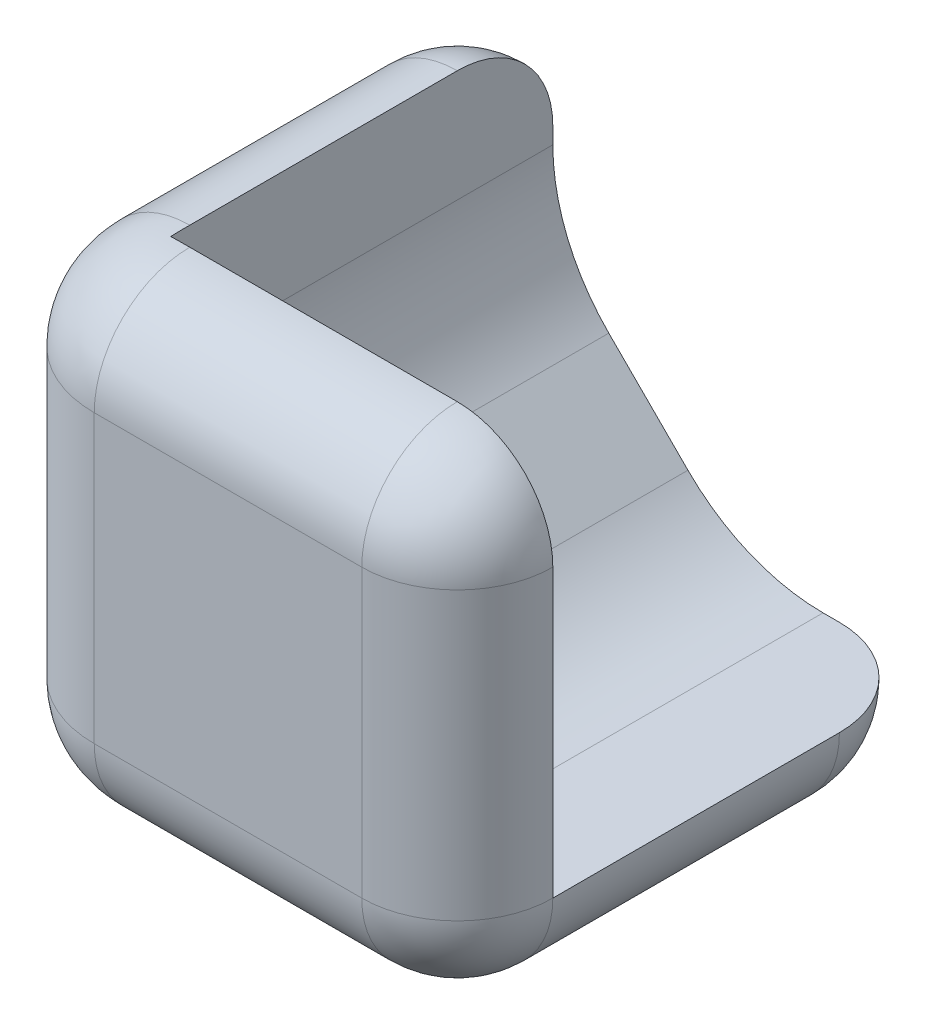
ISO-10303-21;
HEADER;
FILE_DESCRIPTION(('STEP AP214'),'2;1');
FILE_NAME('part.step','',(''),(''),'','','');
FILE_SCHEMA(('AUTOMOTIVE_DESIGN { 1 0 10303 214 1 1 1 1 }'));
ENDSEC;
DATA;
#1=APPLICATION_CONTEXT('core data for automotive mechanical design processes');
#2=APPLICATION_PROTOCOL_DEFINITION('international standard','automotive_design',2000,#1);
#3=PRODUCT_CONTEXT('',#1,'mechanical');
#4=PRODUCT('Part','Part','',(#3));
#5=PRODUCT_RELATED_PRODUCT_CATEGORY('part','',(#4));
#6=PRODUCT_DEFINITION_FORMATION('','',#4);
#7=PRODUCT_DEFINITION_CONTEXT('part definition',#1,'design');
#8=PRODUCT_DEFINITION('design','',#6,#7);
#9=PRODUCT_DEFINITION_SHAPE('','',#8);
#10=(LENGTH_UNIT() NAMED_UNIT(*) SI_UNIT(.MILLI.,.METRE.));
#11=(NAMED_UNIT(*) PLANE_ANGLE_UNIT() SI_UNIT($,.RADIAN.));
#12=(NAMED_UNIT(*) SI_UNIT($,.STERADIAN.) SOLID_ANGLE_UNIT());
#13=UNCERTAINTY_MEASURE_WITH_UNIT(LENGTH_MEASURE(1.E-05),#10,'distance_accuracy_value','');
#14=(GEOMETRIC_REPRESENTATION_CONTEXT(3) GLOBAL_UNCERTAINTY_ASSIGNED_CONTEXT((#13)) GLOBAL_UNIT_ASSIGNED_CONTEXT((#10,
#11,#12)) REPRESENTATION_CONTEXT('',''));
#15=CARTESIAN_POINT('',(0.,0.,0.));
#16=DIRECTION('',(0.,0.,1.));
#17=DIRECTION('',(1.,0.,0.));
#18=AXIS2_PLACEMENT_3D('',#15,#16,#17);
#19=CARTESIAN_POINT('',(0.,20.,-10.));
#20=DIRECTION('',(0.,0.,-1.));
#21=DIRECTION('',(-1.,0.,0.));
#22=AXIS2_PLACEMENT_3D('',#19,#20,#21);
#23=PLANE('',#22);
#24=CARTESIAN_POINT('',(7.07106781186547,15.,-10.));
#25=DIRECTION('',(0.,0.,-1.));
#26=DIRECTION('',(-1.,0.,0.));
#27=AXIS2_PLACEMENT_3D('',#24,#25,#26);
#28=CIRCLE('',#27,5.);
#29=CARTESIAN_POINT('',(7.0710678118655,10.,-10.));
#30=VERTEX_POINT('',#29);
#31=CARTESIAN_POINT('',(3.53553390593272,11.4644660940673,-10.));
#32=VERTEX_POINT('',#31);
#33=EDGE_CURVE('E171',#30,#32,#28,.T.);
#34=ORIENTED_EDGE('',*,*,#33,.F.);
#35=DIRECTION('',(1.,0.,0.));
#36=VECTOR('',#35,1.);
#37=CARTESIAN_POINT('',(0.,10.,-10.));
#38=LINE('',#37,#36);
#39=CARTESIAN_POINT('',(0.,10.,-10.));
#40=VERTEX_POINT('',#39);
#41=EDGE_CURVE('E381',#30,#40,#38,.F.);
#42=ORIENTED_EDGE('',*,*,#41,.T.);
#43=DIRECTION('',(0.,1.,0.));
#44=VECTOR('',#43,1.);
#45=CARTESIAN_POINT('',(0.,20.,-10.));
#46=LINE('',#45,#44);
#47=CARTESIAN_POINT('',(0.,17.0710678118655,-10.));
#48=VERTEX_POINT('',#47);
#49=EDGE_CURVE('E169',#40,#48,#46,.T.);
#50=ORIENTED_EDGE('',*,*,#49,.T.);
#51=CARTESIAN_POINT('',(5.,17.0710678118655,-10.));
#52=DIRECTION('',(0.,0.,-1.));
#53=DIRECTION('',(-1.,0.,0.));
#54=AXIS2_PLACEMENT_3D('',#51,#52,#53);
#55=CIRCLE('',#54,5.);
#56=CARTESIAN_POINT('',(1.46446609406728,13.5355339059327,-10.));
#57=VERTEX_POINT('',#56);
#58=EDGE_CURVE('E155',#57,#48,#55,.T.);
#59=ORIENTED_EDGE('',*,*,#58,.F.);
#60=DIRECTION('',(-0.707106781186548,0.707106781186547,0.));
#61=VECTOR('',#60,1.);
#62=CARTESIAN_POINT('',(7.5,7.5,-10.));
#63=LINE('',#62,#61);
#64=EDGE_CURVE('E167',#32,#57,#63,.T.);
#65=ORIENTED_EDGE('',*,*,#64,.F.);
#66=EDGE_LOOP('',(#34,#42,#50,#59,#65));
#67=FACE_BOUND('',#66,.T.);
#68=ADVANCED_FACE('F39',(#67),#23,.T.);
#69=CARTESIAN_POINT('',(0.,10.,0.));
#70=DIRECTION('',(0.,-1.,0.));
#71=DIRECTION('',(0.,0.,-1.));
#72=AXIS2_PLACEMENT_3D('',#69,#70,#71);
#73=PLANE('',#72);
#74=DIRECTION('',(0.,0.,-1.));
#75=VECTOR('',#74,1.);
#76=CARTESIAN_POINT('',(10.,10.,0.));
#77=LINE('',#76,#75);
#78=CARTESIAN_POINT('',(10.,10.,0.));
#79=VERTEX_POINT('',#78);
#80=CARTESIAN_POINT('',(10.,10.,-7.5));
#81=VERTEX_POINT('',#80);
#82=EDGE_CURVE('E202',#79,#81,#77,.T.);
#83=ORIENTED_EDGE('',*,*,#82,.T.);
#84=CARTESIAN_POINT('',(7.5,10.,-7.5));
#85=DIRECTION('',(0.,-1.,0.));
#86=DIRECTION('',(0.,0.,-1.));
#87=AXIS2_PLACEMENT_3D('',#84,#85,#86);
#88=CIRCLE('',#87,2.5);
#89=CARTESIAN_POINT('',(7.5,10.,-10.));
#90=VERTEX_POINT('',#89);
#91=EDGE_CURVE('E11',#81,#90,#88,.F.);
#92=ORIENTED_EDGE('',*,*,#91,.T.);
#93=DIRECTION('',(-1.,0.,0.));
#94=VECTOR('',#93,1.);
#95=CARTESIAN_POINT('',(0.,10.,-10.));
#96=LINE('',#95,#94);
#97=EDGE_CURVE('E206',#90,#30,#96,.T.);
#98=ORIENTED_EDGE('',*,*,#97,.T.);
#99=DIRECTION('',(0.,0.,1.));
#100=VECTOR('',#99,1.);
#101=CARTESIAN_POINT('',(7.0710678118655,10.,-10.));
#102=LINE('',#101,#100);
#103=CARTESIAN_POINT('',(7.0710678118655,10.,0.));
#104=VERTEX_POINT('',#103);
#105=EDGE_CURVE('E187',#30,#104,#102,.T.);
#106=ORIENTED_EDGE('',*,*,#105,.T.);
#107=DIRECTION('',(1.,0.,0.));
#108=VECTOR('',#107,1.);
#109=CARTESIAN_POINT('',(20.,10.,0.));
#110=LINE('',#109,#108);
#111=EDGE_CURVE('E190',#104,#79,#110,.T.);
#112=ORIENTED_EDGE('',*,*,#111,.T.);
#113=EDGE_LOOP('',(#83,#92,#98,#106,#112));
#114=FACE_BOUND('',#113,.T.);
#115=ADVANCED_FACE('F237',(#114),#73,.F.);
#116=CARTESIAN_POINT('',(0.,10.,-20.));
#117=DIRECTION('',(-1.,0.,0.));
#118=DIRECTION('',(0.,0.,1.));
#119=AXIS2_PLACEMENT_3D('',#116,#117,#118);
#120=PLANE('',#119);
#121=DIRECTION('',(0.,1.,0.));
#122=VECTOR('',#121,1.);
#123=CARTESIAN_POINT('',(0.,20.,-10.));
#124=LINE('',#123,#122);
#125=CARTESIAN_POINT('',(0.,17.5,-10.));
#126=VERTEX_POINT('',#125);
#127=EDGE_CURVE('E200',#48,#126,#124,.T.);
#128=ORIENTED_EDGE('',*,*,#127,.T.);
#129=CARTESIAN_POINT('',(0.,17.5,-7.5));
#130=DIRECTION('',(-1.,0.,0.));
#131=DIRECTION('',(0.,0.,1.));
#132=AXIS2_PLACEMENT_3D('',#129,#130,#131);
#133=CIRCLE('',#132,2.5);
#134=CARTESIAN_POINT('',(0.,20.,-7.5));
#135=VERTEX_POINT('',#134);
#136=EDGE_CURVE('E377',#126,#135,#133,.F.);
#137=ORIENTED_EDGE('',*,*,#136,.T.);
#138=DIRECTION('',(0.,0.,1.));
#139=VECTOR('',#138,1.);
#140=CARTESIAN_POINT('',(0.,20.,0.));
#141=LINE('',#140,#139);
#142=CARTESIAN_POINT('',(0.,20.,-0.5));
#143=VERTEX_POINT('',#142);
#144=EDGE_CURVE('E204',#135,#143,#141,.T.);
#145=ORIENTED_EDGE('',*,*,#144,.T.);
#146=CARTESIAN_POINT('',(0.,20.,-0.5));
#147=CARTESIAN_POINT('',(0.,19.9999555590469,-0.458322618836104));
#148=CARTESIAN_POINT('',(0.,20.0000042889637,-0.416644369246161));
#149=CARTESIAN_POINT('',(0.,19.9999009024132,-0.333297581464345));
#150=CARTESIAN_POINT('',(0.,19.9997488300437,-0.291629043149498));
#151=CARTESIAN_POINT('',(0.,19.9988568555154,-0.208284004328043));
#152=CARTESIAN_POINT('',(0.,19.9981168007554,-0.166607504562833));
#153=CARTESIAN_POINT('',(0.,19.9956258247218,-0.0832771616506614));
#154=CARTESIAN_POINT('',(0.,19.9938746786647,-0.0416233256040609));
#155=CARTESIAN_POINT('',(0.,19.9914065868875,0.));
#156=B_SPLINE_CURVE_WITH_KNOTS('',3,(#146,#147,#148,#149,#150,#151,#152,#153,#154,#155),
.UNSPECIFIED.,.F.,.F.,(4,2,2,2,4),(0.,0.125033609268124,0.250039764792167,0.375078374192874,
0.500144792594201),.UNSPECIFIED.);
#157=CARTESIAN_POINT('',(0.,19.9914065868875,0.));
#158=VERTEX_POINT('',#157);
#159=EDGE_CURVE('E215',#143,#158,#156,.T.);
#160=ORIENTED_EDGE('',*,*,#159,.T.);
#161=DIRECTION('',(0.,1.,0.));
#162=VECTOR('',#161,1.);
#163=CARTESIAN_POINT('',(0.,10.,0.));
#164=LINE('',#163,#162);
#165=CARTESIAN_POINT('',(0.,17.0710678118655,0.));
#166=VERTEX_POINT('',#165);
#167=EDGE_CURVE('E193',#166,#158,#164,.T.);
#168=ORIENTED_EDGE('',*,*,#167,.F.);
#169=DIRECTION('',(0.,0.,1.));
#170=VECTOR('',#169,1.);
#171=CARTESIAN_POINT('',(0.,17.0710678118655,-10.));
#172=LINE('',#171,#170);
#173=EDGE_CURVE('E161',#48,#166,#172,.T.);
#174=ORIENTED_EDGE('',*,*,#173,.F.);
#175=EDGE_LOOP('',(#128,#137,#145,#160,#168,#174));
#176=FACE_BOUND('',#175,.T.);
#177=ADVANCED_FACE('F232',(#176),#120,.F.);
#178=CARTESIAN_POINT('',(20.,10.,0.));
#179=DIRECTION('',(0.,0.,1.));
#180=DIRECTION('',(1.,0.,0.));
#181=AXIS2_PLACEMENT_3D('',#178,#179,#180);
#182=PLANE('',#181);
#183=DIRECTION('',(1.,0.,0.));
#184=VECTOR('',#183,1.);
#185=CARTESIAN_POINT('',(20.,20.,0.));
#186=LINE('',#185,#184);
#187=CARTESIAN_POINT('',(0.500000000000003,20.,0.));
#188=VERTEX_POINT('',#187);
#189=CARTESIAN_POINT('',(7.5,20.,0.));
#190=VERTEX_POINT('',#189);
#191=EDGE_CURVE('E189',#188,#190,#186,.T.);
#192=ORIENTED_EDGE('',*,*,#191,.T.);
#193=CARTESIAN_POINT('',(7.5,17.5,0.));
#194=DIRECTION('',(0.,0.,1.));
#195=DIRECTION('',(1.,0.,0.));
#196=AXIS2_PLACEMENT_3D('',#193,#194,#195);
#197=CIRCLE('',#196,2.5);
#198=CARTESIAN_POINT('',(10.,17.5,0.));
#199=VERTEX_POINT('',#198);
#200=EDGE_CURVE('E276',#190,#199,#197,.F.);
#201=ORIENTED_EDGE('',*,*,#200,.T.);
#202=DIRECTION('',(0.,-1.,0.));
#203=VECTOR('',#202,1.);
#204=CARTESIAN_POINT('',(10.,20.,0.));
#205=LINE('',#204,#203);
#206=EDGE_CURVE('E198',#199,#79,#205,.T.);
#207=ORIENTED_EDGE('',*,*,#206,.T.);
#208=ORIENTED_EDGE('',*,*,#111,.F.);
#209=CARTESIAN_POINT('',(7.07106781186547,15.,0.));
#210=DIRECTION('',(0.,0.,-1.));
#211=DIRECTION('',(-1.,0.,0.));
#212=AXIS2_PLACEMENT_3D('',#209,#210,#211);
#213=CIRCLE('',#212,5.);
#214=CARTESIAN_POINT('',(3.53553390593272,11.4644660940673,0.));
#215=VERTEX_POINT('',#214);
#216=EDGE_CURVE('E180',#104,#215,#213,.T.);
#217=ORIENTED_EDGE('',*,*,#216,.T.);
#218=DIRECTION('',(-0.707106781186548,0.707106781186547,0.));
#219=VECTOR('',#218,1.);
#220=CARTESIAN_POINT('',(7.5,7.5,0.));
#221=LINE('',#220,#219);
#222=CARTESIAN_POINT('',(1.46446609406728,13.5355339059327,0.));
#223=VERTEX_POINT('',#222);
#224=EDGE_CURVE('E184',#215,#223,#221,.T.);
#225=ORIENTED_EDGE('',*,*,#224,.T.);
#226=CARTESIAN_POINT('',(5.,17.0710678118655,0.));
#227=DIRECTION('',(0.,0.,-1.));
#228=DIRECTION('',(-1.,0.,0.));
#229=AXIS2_PLACEMENT_3D('',#226,#227,#228);
#230=CIRCLE('',#229,5.);
#231=EDGE_CURVE('E157',#223,#166,#230,.T.);
#232=ORIENTED_EDGE('',*,*,#231,.T.);
#233=ORIENTED_EDGE('',*,*,#167,.T.);
#234=CARTESIAN_POINT('',(0.,19.9914065868875,0.));
#235=CARTESIAN_POINT('',(0.0416233256040611,19.9938746786647,0.));
#236=CARTESIAN_POINT('',(0.0832771616506618,19.9956258247218,0.));
#237=CARTESIAN_POINT('',(0.166607504562834,19.9981168007554,0.));
#238=CARTESIAN_POINT('',(0.208284004328044,19.9988568555154,0.));
#239=CARTESIAN_POINT('',(0.291629043149499,19.9997488300437,0.));
#240=CARTESIAN_POINT('',(0.333297581464347,19.9999009024132,0.));
#241=CARTESIAN_POINT('',(0.416644369246164,20.0000042889637,0.));
#242=CARTESIAN_POINT('',(0.458322618836106,19.9999555590469,0.));
#243=CARTESIAN_POINT('',(0.500000000000002,20.,0.));
#244=B_SPLINE_CURVE_WITH_KNOTS('',3,(#234,#235,#236,#237,#238,#239,#240,#241,#242,#243),
.UNSPECIFIED.,.F.,.F.,(4,2,2,2,4),(0.,0.125066418401328,0.250105027802036,0.375111183326079,
0.500144792594204),.UNSPECIFIED.);
#245=EDGE_CURVE('E222',#158,#188,#244,.T.);
#246=ORIENTED_EDGE('',*,*,#245,.T.);
#247=EDGE_LOOP('',(#192,#201,#207,#208,#217,#225,#232,#233,#246));
#248=FACE_BOUND('',#247,.T.);
#249=ADVANCED_FACE('F236',(#248),#182,.F.);
#250=CARTESIAN_POINT('',(7.07106781186547,15.,-10.));
#251=DIRECTION('',(0.,0.,1.));
#252=DIRECTION('',(1.,0.,0.));
#253=AXIS2_PLACEMENT_3D('',#250,#251,#252);
#254=CYLINDRICAL_SURFACE('',#253,5.);
#255=ORIENTED_EDGE('',*,*,#216,.F.);
#256=ORIENTED_EDGE('',*,*,#105,.F.);
#257=ORIENTED_EDGE('',*,*,#33,.T.);
#258=DIRECTION('',(0.,0.,1.));
#259=VECTOR('',#258,1.);
#260=CARTESIAN_POINT('',(3.53553390593272,11.4644660940673,-10.));
#261=LINE('',#260,#259);
#262=EDGE_CURVE('E162',#32,#215,#261,.T.);
#263=ORIENTED_EDGE('',*,*,#262,.T.);
#264=EDGE_LOOP('',(#255,#256,#257,#263));
#265=FACE_BOUND('',#264,.T.);
#266=ADVANCED_FACE('F434',(#265),#254,.F.);
#267=CARTESIAN_POINT('',(5.,17.0710678118655,-10.));
#268=DIRECTION('',(0.,0.,1.));
#269=DIRECTION('',(1.,0.,0.));
#270=AXIS2_PLACEMENT_3D('',#267,#268,#269);
#271=CYLINDRICAL_SURFACE('',#270,5.);
#272=ORIENTED_EDGE('',*,*,#231,.F.);
#273=DIRECTION('',(0.,0.,1.));
#274=VECTOR('',#273,1.);
#275=CARTESIAN_POINT('',(1.46446609406728,13.5355339059327,-10.));
#276=LINE('',#275,#274);
#277=EDGE_CURVE('E151',#57,#223,#276,.T.);
#278=ORIENTED_EDGE('',*,*,#277,.F.);
#279=ORIENTED_EDGE('',*,*,#58,.T.);
#280=ORIENTED_EDGE('',*,*,#173,.T.);
#281=EDGE_LOOP('',(#272,#278,#279,#280));
#282=FACE_BOUND('',#281,.T.);
#283=ADVANCED_FACE('F153',(#282),#271,.F.);
#284=CARTESIAN_POINT('',(7.5,7.5,-10.));
#285=DIRECTION('',(0.707106781186547,0.707106781186548,0.));
#286=DIRECTION('',(-0.707106781186548,0.707106781186547,0.));
#287=AXIS2_PLACEMENT_3D('',#284,#285,#286);
#288=PLANE('',#287);
#289=ORIENTED_EDGE('',*,*,#224,.F.);
#290=ORIENTED_EDGE('',*,*,#262,.F.);
#291=ORIENTED_EDGE('',*,*,#64,.T.);
#292=ORIENTED_EDGE('',*,*,#277,.T.);
#293=EDGE_LOOP('',(#289,#290,#291,#292));
#294=FACE_BOUND('',#293,.T.);
#295=ADVANCED_FACE('F173',(#294),#288,.T.);
#296=CARTESIAN_POINT('',(-2.5,-5.00000000000001,0.));
#297=DIRECTION('',(-1.,0.,0.));
#298=DIRECTION('',(0.,0.,1.));
#299=AXIS2_PLACEMENT_3D('',#296,#297,#298);
#300=PLANE('',#299);
#301=DIRECTION('',(0.,0.,1.));
#302=VECTOR('',#301,1.);
#303=CARTESIAN_POINT('',(-2.5,17.5,0.));
#304=LINE('',#303,#302);
#305=CARTESIAN_POINT('',(-2.5,17.5,-0.499999999999999));
#306=VERTEX_POINT('',#305);
#307=CARTESIAN_POINT('',(-2.5,17.5,-7.5));
#308=VERTEX_POINT('',#307);
#309=EDGE_CURVE('E390',#306,#308,#304,.F.);
#310=ORIENTED_EDGE('',*,*,#309,.T.);
#311=DIRECTION('',(0.,1.,0.));
#312=VECTOR('',#311,1.);
#313=CARTESIAN_POINT('',(-2.5,-5.00000000000001,-7.5));
#314=LINE('',#313,#312);
#315=CARTESIAN_POINT('',(-2.5,10.,-7.5));
#316=VERTEX_POINT('',#315);
#317=EDGE_CURVE('E277',#308,#316,#314,.F.);
#318=ORIENTED_EDGE('',*,*,#317,.T.);
#319=DIRECTION('',(0.,0.,-1.));
#320=VECTOR('',#319,1.);
#321=CARTESIAN_POINT('',(-2.5,10.,-0.499999999999998));
#322=LINE('',#321,#320);
#323=CARTESIAN_POINT('',(-2.5,10.,-0.499999999999999));
#324=VERTEX_POINT('',#323);
#325=EDGE_CURVE('E403',#316,#324,#322,.F.);
#326=ORIENTED_EDGE('',*,*,#325,.T.);
#327=DIRECTION('',(0.,1.,0.));
#328=VECTOR('',#327,1.);
#329=CARTESIAN_POINT('',(-2.5,20.,-0.499999999999999));
#330=LINE('',#329,#328);
#331=EDGE_CURVE('E208',#324,#306,#330,.T.);
#332=ORIENTED_EDGE('',*,*,#331,.T.);
#333=EDGE_LOOP('',(#310,#318,#326,#332));
#334=FACE_BOUND('',#333,.T.);
#335=ADVANCED_FACE('F427',(#334),#300,.T.);
#336=CARTESIAN_POINT('',(0.,-5.00000000000001,2.5));
#337=DIRECTION('',(0.,0.,-1.));
#338=DIRECTION('',(-1.,0.,0.));
#339=AXIS2_PLACEMENT_3D('',#336,#337,#338);
#340=PLANE('',#339);
#341=DIRECTION('',(1.,0.,0.));
#342=VECTOR('',#341,1.);
#343=CARTESIAN_POINT('',(0.,10.,2.5));
#344=LINE('',#343,#342);
#345=CARTESIAN_POINT('',(0.500000000000003,10.,2.5));
#346=VERTEX_POINT('',#345);
#347=CARTESIAN_POINT('',(7.5,10.,2.5));
#348=VERTEX_POINT('',#347);
#349=EDGE_CURVE('E386',#346,#348,#344,.T.);
#350=ORIENTED_EDGE('',*,*,#349,.T.);
#351=DIRECTION('',(0.,1.,0.));
#352=VECTOR('',#351,1.);
#353=CARTESIAN_POINT('',(7.5,17.5,2.5));
#354=LINE('',#353,#352);
#355=CARTESIAN_POINT('',(7.5,17.5,2.5));
#356=VERTEX_POINT('',#355);
#357=EDGE_CURVE('E283',#348,#356,#354,.T.);
#358=ORIENTED_EDGE('',*,*,#357,.T.);
#359=DIRECTION('',(-1.,0.,0.));
#360=VECTOR('',#359,1.);
#361=CARTESIAN_POINT('',(0.500000000000003,17.5,2.5));
#362=LINE('',#361,#360);
#363=CARTESIAN_POINT('',(0.500000000000003,17.5,2.5));
#364=VERTEX_POINT('',#363);
#365=EDGE_CURVE('E213',#356,#364,#362,.T.);
#366=ORIENTED_EDGE('',*,*,#365,.T.);
#367=DIRECTION('',(0.,1.,0.));
#368=VECTOR('',#367,1.);
#369=CARTESIAN_POINT('',(0.500000000000003,7.5,2.5));
#370=LINE('',#369,#368);
#371=EDGE_CURVE('E210',#364,#346,#370,.F.);
#372=ORIENTED_EDGE('',*,*,#371,.T.);
#373=EDGE_LOOP('',(#350,#358,#366,#372));
#374=FACE_BOUND('',#373,.T.);
#375=ADVANCED_FACE('F385',(#374),#340,.F.);
#376=CARTESIAN_POINT('',(-15.,7.5,2.5));
#377=DIRECTION('',(0.,1.,0.));
#378=DIRECTION('',(0.,0.,1.));
#379=AXIS2_PLACEMENT_3D('',#376,#377,#378);
#380=PLANE('',#379);
#381=DIRECTION('',(0.,0.,-1.));
#382=VECTOR('',#381,1.);
#383=CARTESIAN_POINT('',(0.,7.5,-10.));
#384=LINE('',#383,#382);
#385=CARTESIAN_POINT('',(0.,7.5,-0.5));
#386=VERTEX_POINT('',#385);
#387=CARTESIAN_POINT('',(0.,7.5,-7.5));
#388=VERTEX_POINT('',#387);
#389=EDGE_CURVE('E392',#386,#388,#384,.T.);
#390=ORIENTED_EDGE('',*,*,#389,.T.);
#391=DIRECTION('',(1.,0.,0.));
#392=VECTOR('',#391,1.);
#393=CARTESIAN_POINT('',(10.,7.5,-7.5));
#394=LINE('',#393,#392);
#395=CARTESIAN_POINT('',(7.5,7.5,-7.5));
#396=VERTEX_POINT('',#395);
#397=EDGE_CURVE('E411',#388,#396,#394,.T.);
#398=ORIENTED_EDGE('',*,*,#397,.T.);
#399=DIRECTION('',(0.,0.,1.));
#400=VECTOR('',#399,1.);
#401=CARTESIAN_POINT('',(7.5,7.5,0.));
#402=LINE('',#401,#400);
#403=CARTESIAN_POINT('',(7.5,7.5,0.));
#404=VERTEX_POINT('',#403);
#405=EDGE_CURVE('E406',#396,#404,#402,.T.);
#406=ORIENTED_EDGE('',*,*,#405,.T.);
#407=DIRECTION('',(1.,0.,0.));
#408=VECTOR('',#407,1.);
#409=CARTESIAN_POINT('',(-15.,7.5,0.));
#410=LINE('',#409,#408);
#411=CARTESIAN_POINT('',(0.500000000000003,7.5,0.));
#412=VERTEX_POINT('',#411);
#413=EDGE_CURVE('E401',#404,#412,#410,.F.);
#414=ORIENTED_EDGE('',*,*,#413,.T.);
#415=CARTESIAN_POINT('',(0.500000000000003,7.5,-0.5));
#416=DIRECTION('',(0.,1.,0.));
#417=DIRECTION('',(0.,0.,1.));
#418=AXIS2_PLACEMENT_3D('',#415,#416,#417);
#419=CIRCLE('',#418,0.5);
#420=EDGE_CURVE('E389',#412,#386,#419,.F.);
#421=ORIENTED_EDGE('',*,*,#420,.T.);
#422=EDGE_LOOP('',(#390,#398,#406,#414,#421));
#423=FACE_BOUND('',#422,.T.);
#424=ADVANCED_FACE('F246',(#423),#380,.F.);
#425=CARTESIAN_POINT('',(0.500000000000003,-5.00000000000001,-0.5));
#426=DIRECTION('',(0.,-1.,0.));
#427=DIRECTION('',(0.,0.,-1.));
#428=AXIS2_PLACEMENT_3D('',#425,#426,#427);
#429=CYLINDRICAL_SURFACE('',#428,3.);
#430=ORIENTED_EDGE('',*,*,#331,.F.);
#431=CARTESIAN_POINT('',(0.500000000000003,10.,-0.5));
#432=DIRECTION('',(0.,1.,0.));
#433=DIRECTION('',(0.,0.,1.));
#434=AXIS2_PLACEMENT_3D('',#431,#432,#433);
#435=CIRCLE('',#434,3.);
#436=EDGE_CURVE('E405',#324,#346,#435,.T.);
#437=ORIENTED_EDGE('',*,*,#436,.T.);
#438=ORIENTED_EDGE('',*,*,#371,.F.);
#439=CARTESIAN_POINT('',(0.500000000000003,17.5,-0.5));
#440=DIRECTION('',(0.,1.,0.));
#441=DIRECTION('',(0.,0.,1.));
#442=AXIS2_PLACEMENT_3D('',#439,#440,#441);
#443=CIRCLE('',#442,3.);
#444=EDGE_CURVE('E394',#364,#306,#443,.F.);
#445=ORIENTED_EDGE('',*,*,#444,.T.);
#446=EDGE_LOOP('',(#430,#437,#438,#445));
#447=FACE_BOUND('',#446,.T.);
#448=ADVANCED_FACE('F243',(#447),#429,.T.);
#449=CARTESIAN_POINT('',(0.,17.5,0.));
#450=DIRECTION('',(0.,0.,1.));
#451=DIRECTION('',(1.,0.,0.));
#452=AXIS2_PLACEMENT_3D('',#449,#450,#451);
#453=CYLINDRICAL_SURFACE('',#452,2.5);
#454=ORIENTED_EDGE('',*,*,#144,.F.);
#455=CARTESIAN_POINT('',(0.,17.5,-7.5));
#456=DIRECTION('',(0.,0.,1.));
#457=DIRECTION('',(1.,0.,0.));
#458=AXIS2_PLACEMENT_3D('',#455,#456,#457);
#459=CIRCLE('',#458,2.5);
#460=EDGE_CURVE('E371',#135,#308,#459,.T.);
#461=ORIENTED_EDGE('',*,*,#460,.T.);
#462=ORIENTED_EDGE('',*,*,#309,.F.);
#463=CARTESIAN_POINT('',(0.,17.5,-0.5));
#464=DIRECTION('',(0.,0.,1.));
#465=DIRECTION('',(1.,0.,0.));
#466=AXIS2_PLACEMENT_3D('',#463,#464,#465);
#467=CIRCLE('',#466,2.5);
#468=EDGE_CURVE('E182',#143,#306,#467,.T.);
#469=ORIENTED_EDGE('',*,*,#468,.F.);
#470=EDGE_LOOP('',(#454,#461,#462,#469));
#471=FACE_BOUND('',#470,.T.);
#472=ADVANCED_FACE('F245',(#471),#453,.T.);
#473=CARTESIAN_POINT('',(0.500000000000003,17.5,-0.5));
#474=DIRECTION('',(0.,1.,0.));
#475=DIRECTION('',(0.,0.,1.));
#476=AXIS2_PLACEMENT_3D('',#473,#474,#475);
#477=DEGENERATE_TOROIDAL_SURFACE('',#476,0.5,2.5,.T.);
#478=ORIENTED_EDGE('',*,*,#468,.T.);
#479=ORIENTED_EDGE('',*,*,#444,.F.);
#480=CARTESIAN_POINT('',(0.500000000000003,17.5,0.));
#481=DIRECTION('',(1.,0.,0.));
#482=DIRECTION('',(0.,0.,-1.));
#483=AXIS2_PLACEMENT_3D('',#480,#481,#482);
#484=CIRCLE('',#483,2.5);
#485=EDGE_CURVE('E266',#188,#364,#484,.T.);
#486=ORIENTED_EDGE('',*,*,#485,.F.);
#487=ORIENTED_EDGE('',*,*,#245,.F.);
#488=ORIENTED_EDGE('',*,*,#159,.F.);
#489=EDGE_LOOP('',(#478,#479,#486,#487,#488));
#490=FACE_BOUND('',#489,.T.);
#491=ADVANCED_FACE('F228',(#490),#477,.T.);
#492=CARTESIAN_POINT('',(0.,17.5,0.));
#493=DIRECTION('',(1.,0.,0.));
#494=DIRECTION('',(0.,0.,-1.));
#495=AXIS2_PLACEMENT_3D('',#492,#493,#494);
#496=CYLINDRICAL_SURFACE('',#495,2.5);
#497=ORIENTED_EDGE('',*,*,#365,.F.);
#498=CARTESIAN_POINT('',(7.5,17.5,0.));
#499=DIRECTION('',(1.,0.,0.));
#500=DIRECTION('',(0.,0.,-1.));
#501=AXIS2_PLACEMENT_3D('',#498,#499,#500);
#502=CIRCLE('',#501,2.5);
#503=EDGE_CURVE('E264',#356,#190,#502,.F.);
#504=ORIENTED_EDGE('',*,*,#503,.T.);
#505=ORIENTED_EDGE('',*,*,#191,.F.);
#506=ORIENTED_EDGE('',*,*,#485,.T.);
#507=EDGE_LOOP('',(#497,#504,#505,#506));
#508=FACE_BOUND('',#507,.T.);
#509=ADVANCED_FACE('F248',(#508),#496,.T.);
#510=CARTESIAN_POINT('',(0.,10.,2.49999999999999));
#511=DIRECTION('',(0.,0.,1.));
#512=DIRECTION('',(1.,0.,0.));
#513=AXIS2_PLACEMENT_3D('',#510,#511,#512);
#514=CYLINDRICAL_SURFACE('',#513,2.5);
#515=ORIENTED_EDGE('',*,*,#325,.F.);
#516=CARTESIAN_POINT('',(0.,10.,-7.5));
#517=DIRECTION('',(0.,0.,1.));
#518=DIRECTION('',(1.,0.,0.));
#519=AXIS2_PLACEMENT_3D('',#516,#517,#518);
#520=CIRCLE('',#519,2.5);
#521=EDGE_CURVE('E302',#316,#388,#520,.T.);
#522=ORIENTED_EDGE('',*,*,#521,.T.);
#523=ORIENTED_EDGE('',*,*,#389,.F.);
#524=CARTESIAN_POINT('',(0.,10.,-0.499999999999999));
#525=DIRECTION('',(0.,0.,1.));
#526=DIRECTION('',(1.,0.,0.));
#527=AXIS2_PLACEMENT_3D('',#524,#525,#526);
#528=CIRCLE('',#527,2.5);
#529=EDGE_CURVE('E289',#324,#386,#528,.T.);
#530=ORIENTED_EDGE('',*,*,#529,.F.);
#531=EDGE_LOOP('',(#515,#522,#523,#530));
#532=FACE_BOUND('',#531,.T.);
#533=ADVANCED_FACE('F250',(#532),#514,.T.);
#534=CARTESIAN_POINT('',(0.500000000000003,10.,-0.5));
#535=DIRECTION('',(0.,1.,0.));
#536=DIRECTION('',(0.,0.,1.));
#537=AXIS2_PLACEMENT_3D('',#534,#535,#536);
#538=DEGENERATE_TOROIDAL_SURFACE('',#537,0.5,2.5,.T.);
#539=ORIENTED_EDGE('',*,*,#529,.T.);
#540=ORIENTED_EDGE('',*,*,#420,.F.);
#541=CARTESIAN_POINT('',(0.500000000000003,10.,0.));
#542=DIRECTION('',(1.,0.,0.));
#543=DIRECTION('',(0.,0.,-1.));
#544=AXIS2_PLACEMENT_3D('',#541,#542,#543);
#545=CIRCLE('',#544,2.5);
#546=EDGE_CURVE('E285',#346,#412,#545,.T.);
#547=ORIENTED_EDGE('',*,*,#546,.F.);
#548=ORIENTED_EDGE('',*,*,#436,.F.);
#549=EDGE_LOOP('',(#539,#540,#547,#548));
#550=FACE_BOUND('',#549,.T.);
#551=ADVANCED_FACE('F256',(#550),#538,.T.);
#552=CARTESIAN_POINT('',(0.,10.,0.));
#553=DIRECTION('',(1.,0.,0.));
#554=DIRECTION('',(0.,0.,-1.));
#555=AXIS2_PLACEMENT_3D('',#552,#553,#554);
#556=CYLINDRICAL_SURFACE('',#555,2.5);
#557=ORIENTED_EDGE('',*,*,#413,.F.);
#558=CARTESIAN_POINT('',(7.5,10.,0.));
#559=DIRECTION('',(1.,0.,0.));
#560=DIRECTION('',(0.,0.,-1.));
#561=AXIS2_PLACEMENT_3D('',#558,#559,#560);
#562=CIRCLE('',#561,2.5);
#563=EDGE_CURVE('E298',#404,#348,#562,.F.);
#564=ORIENTED_EDGE('',*,*,#563,.T.);
#565=ORIENTED_EDGE('',*,*,#349,.F.);
#566=ORIENTED_EDGE('',*,*,#546,.T.);
#567=EDGE_LOOP('',(#557,#564,#565,#566));
#568=FACE_BOUND('',#567,.T.);
#569=ADVANCED_FACE('F354',(#568),#556,.T.);
#570=CARTESIAN_POINT('',(7.5,17.5,0.));
#571=DIRECTION('',(1.,0.,0.));
#572=DIRECTION('',(0.,0.,-1.));
#573=AXIS2_PLACEMENT_3D('',#570,#571,#572);
#574=SPHERICAL_SURFACE('',#573,2.5);
#575=ORIENTED_EDGE('',*,*,#200,.F.);
#576=ORIENTED_EDGE('',*,*,#503,.F.);
#577=CARTESIAN_POINT('',(7.5,17.5,0.));
#578=DIRECTION('',(0.,-1.,0.));
#579=DIRECTION('',(0.,0.,-1.));
#580=AXIS2_PLACEMENT_3D('',#577,#578,#579);
#581=CIRCLE('',#580,2.5);
#582=EDGE_CURVE('E274',#199,#356,#581,.T.);
#583=ORIENTED_EDGE('',*,*,#582,.F.);
#584=EDGE_LOOP('',(#575,#576,#583));
#585=FACE_BOUND('',#584,.T.);
#586=ADVANCED_FACE('F273',(#585),#574,.T.);
#587=CARTESIAN_POINT('',(0.,17.5,-7.5));
#588=DIRECTION('',(0.,0.,-1.));
#589=DIRECTION('',(-1.,0.,0.));
#590=AXIS2_PLACEMENT_3D('',#587,#588,#589);
#591=SPHERICAL_SURFACE('',#590,2.5);
#592=ORIENTED_EDGE('',*,*,#460,.F.);
#593=ORIENTED_EDGE('',*,*,#136,.F.);
#594=CARTESIAN_POINT('',(0.,17.5,-7.5));
#595=DIRECTION('',(0.,-1.,0.));
#596=DIRECTION('',(0.,0.,-1.));
#597=AXIS2_PLACEMENT_3D('',#594,#595,#596);
#598=CIRCLE('',#597,2.5);
#599=EDGE_CURVE('E286',#308,#126,#598,.T.);
#600=ORIENTED_EDGE('',*,*,#599,.F.);
#601=EDGE_LOOP('',(#592,#593,#600));
#602=FACE_BOUND('',#601,.T.);
#603=ADVANCED_FACE('F350',(#602),#591,.T.);
#604=CARTESIAN_POINT('',(7.5,-5.00000000000001,0.));
#605=DIRECTION('',(0.,-1.,0.));
#606=DIRECTION('',(0.,0.,-1.));
#607=AXIS2_PLACEMENT_3D('',#604,#605,#606);
#608=CYLINDRICAL_SURFACE('',#607,2.5);
#609=ORIENTED_EDGE('',*,*,#582,.T.);
#610=ORIENTED_EDGE('',*,*,#357,.F.);
#611=CARTESIAN_POINT('',(7.5,10.,0.));
#612=DIRECTION('',(0.,-1.,0.));
#613=DIRECTION('',(0.,0.,-1.));
#614=AXIS2_PLACEMENT_3D('',#611,#612,#613);
#615=CIRCLE('',#614,2.5);
#616=EDGE_CURVE('E292',#79,#348,#615,.T.);
#617=ORIENTED_EDGE('',*,*,#616,.F.);
#618=ORIENTED_EDGE('',*,*,#206,.F.);
#619=EDGE_LOOP('',(#609,#610,#617,#618));
#620=FACE_BOUND('',#619,.T.);
#621=ADVANCED_FACE('F281',(#620),#608,.T.);
#622=CARTESIAN_POINT('',(0.,20.,-7.5));
#623=DIRECTION('',(0.,1.,0.));
#624=DIRECTION('',(0.,0.,1.));
#625=AXIS2_PLACEMENT_3D('',#622,#623,#624);
#626=CYLINDRICAL_SURFACE('',#625,2.5);
#627=ORIENTED_EDGE('',*,*,#127,.F.);
#628=ORIENTED_EDGE('',*,*,#49,.F.);
#629=CARTESIAN_POINT('',(0.,10.,-7.5));
#630=DIRECTION('',(0.,-1.,0.));
#631=DIRECTION('',(0.,0.,-1.));
#632=AXIS2_PLACEMENT_3D('',#629,#630,#631);
#633=CIRCLE('',#632,2.5);
#634=EDGE_CURVE('E318',#316,#40,#633,.T.);
#635=ORIENTED_EDGE('',*,*,#634,.F.);
#636=ORIENTED_EDGE('',*,*,#317,.F.);
#637=ORIENTED_EDGE('',*,*,#599,.T.);
#638=EDGE_LOOP('',(#627,#628,#635,#636,#637));
#639=FACE_BOUND('',#638,.T.);
#640=ADVANCED_FACE('F344',(#639),#626,.T.);
#641=CARTESIAN_POINT('',(7.5,10.,0.));
#642=DIRECTION('',(1.,0.,0.));
#643=DIRECTION('',(0.,0.,-1.));
#644=AXIS2_PLACEMENT_3D('',#641,#642,#643);
#645=SPHERICAL_SURFACE('',#644,2.5);
#646=ORIENTED_EDGE('',*,*,#616,.T.);
#647=ORIENTED_EDGE('',*,*,#563,.F.);
#648=CARTESIAN_POINT('',(7.5,10.,0.));
#649=DIRECTION('',(0.,0.,-1.));
#650=DIRECTION('',(0.,1.,0.));
#651=AXIS2_PLACEMENT_3D('',#648,#649,#650);
#652=CIRCLE('',#651,2.5);
#653=EDGE_CURVE('E315',#79,#404,#652,.T.);
#654=ORIENTED_EDGE('',*,*,#653,.F.);
#655=EDGE_LOOP('',(#646,#647,#654));
#656=FACE_BOUND('',#655,.T.);
#657=ADVANCED_FACE('F322',(#656),#645,.T.);
#658=CARTESIAN_POINT('',(0.,10.,-7.5));
#659=DIRECTION('',(0.,0.,-1.));
#660=DIRECTION('',(-1.,0.,0.));
#661=AXIS2_PLACEMENT_3D('',#658,#659,#660);
#662=SPHERICAL_SURFACE('',#661,2.5);
#663=ORIENTED_EDGE('',*,*,#521,.F.);
#664=ORIENTED_EDGE('',*,*,#634,.T.);
#665=CARTESIAN_POINT('',(0.,10.,-7.5));
#666=DIRECTION('',(1.,0.,0.));
#667=DIRECTION('',(0.,1.,0.));
#668=AXIS2_PLACEMENT_3D('',#665,#666,#667);
#669=CIRCLE('',#668,2.5);
#670=EDGE_CURVE('E312',#388,#40,#669,.T.);
#671=ORIENTED_EDGE('',*,*,#670,.F.);
#672=EDGE_LOOP('',(#663,#664,#671));
#673=FACE_BOUND('',#672,.T.);
#674=ADVANCED_FACE('F335',(#673),#662,.T.);
#675=CARTESIAN_POINT('',(7.5,10.,2.5));
#676=DIRECTION('',(0.,0.,-1.));
#677=DIRECTION('',(0.,1.,0.));
#678=AXIS2_PLACEMENT_3D('',#675,#676,#677);
#679=CYLINDRICAL_SURFACE('',#678,2.5);
#680=ORIENTED_EDGE('',*,*,#405,.F.);
#681=CARTESIAN_POINT('',(7.5,10.,-7.5));
#682=DIRECTION('',(0.,0.,-1.));
#683=DIRECTION('',(0.,1.,0.));
#684=AXIS2_PLACEMENT_3D('',#681,#682,#683);
#685=CIRCLE('',#684,2.5);
#686=EDGE_CURVE('E47',#396,#81,#685,.F.);
#687=ORIENTED_EDGE('',*,*,#686,.T.);
#688=ORIENTED_EDGE('',*,*,#82,.F.);
#689=ORIENTED_EDGE('',*,*,#653,.T.);
#690=EDGE_LOOP('',(#680,#687,#688,#689));
#691=FACE_BOUND('',#690,.T.);
#692=ADVANCED_FACE('F323',(#691),#679,.T.);
#693=CARTESIAN_POINT('',(-15.,10.,-7.5));
#694=DIRECTION('',(-1.,0.,0.));
#695=DIRECTION('',(0.,0.,1.));
#696=AXIS2_PLACEMENT_3D('',#693,#694,#695);
#697=CYLINDRICAL_SURFACE('',#696,2.5);
#698=ORIENTED_EDGE('',*,*,#97,.F.);
#699=CARTESIAN_POINT('',(7.5,10.,-7.5));
#700=DIRECTION('',(-1.,0.,0.));
#701=DIRECTION('',(0.,0.,1.));
#702=AXIS2_PLACEMENT_3D('',#699,#700,#701);
#703=CIRCLE('',#702,2.5);
#704=EDGE_CURVE('E296',#90,#396,#703,.T.);
#705=ORIENTED_EDGE('',*,*,#704,.T.);
#706=ORIENTED_EDGE('',*,*,#397,.F.);
#707=ORIENTED_EDGE('',*,*,#670,.T.);
#708=ORIENTED_EDGE('',*,*,#41,.F.);
#709=EDGE_LOOP('',(#698,#705,#706,#707,#708));
#710=FACE_BOUND('',#709,.T.);
#711=ADVANCED_FACE('F327',(#710),#697,.T.);
#712=CARTESIAN_POINT('',(7.5,10.,-7.5));
#713=DIRECTION('',(0.,0.,1.));
#714=DIRECTION('',(1.,0.,0.));
#715=AXIS2_PLACEMENT_3D('',#712,#713,#714);
#716=SPHERICAL_SURFACE('',#715,2.5);
#717=ORIENTED_EDGE('',*,*,#91,.F.);
#718=ORIENTED_EDGE('',*,*,#686,.F.);
#719=ORIENTED_EDGE('',*,*,#704,.F.);
#720=EDGE_LOOP('',(#717,#718,#719));
#721=FACE_BOUND('',#720,.T.);
#722=ADVANCED_FACE('F41',(#721),#716,.T.);
#723=CLOSED_SHELL('',(#68,#115,#177,#249,#266,#283,#295,#335,#375,#424,#448,#472,#491,#509,#533,
#551,#569,#586,#603,#621,#640,#657,#674,#692,#711,#722));
#724=MANIFOLD_SOLID_BREP('B2',#723);
#725=ADVANCED_BREP_SHAPE_REPRESENTATION('',(#18,#724),#14);
#726=SHAPE_DEFINITION_REPRESENTATION(#9,#725);
ENDSEC;
END-ISO-10303-21;
